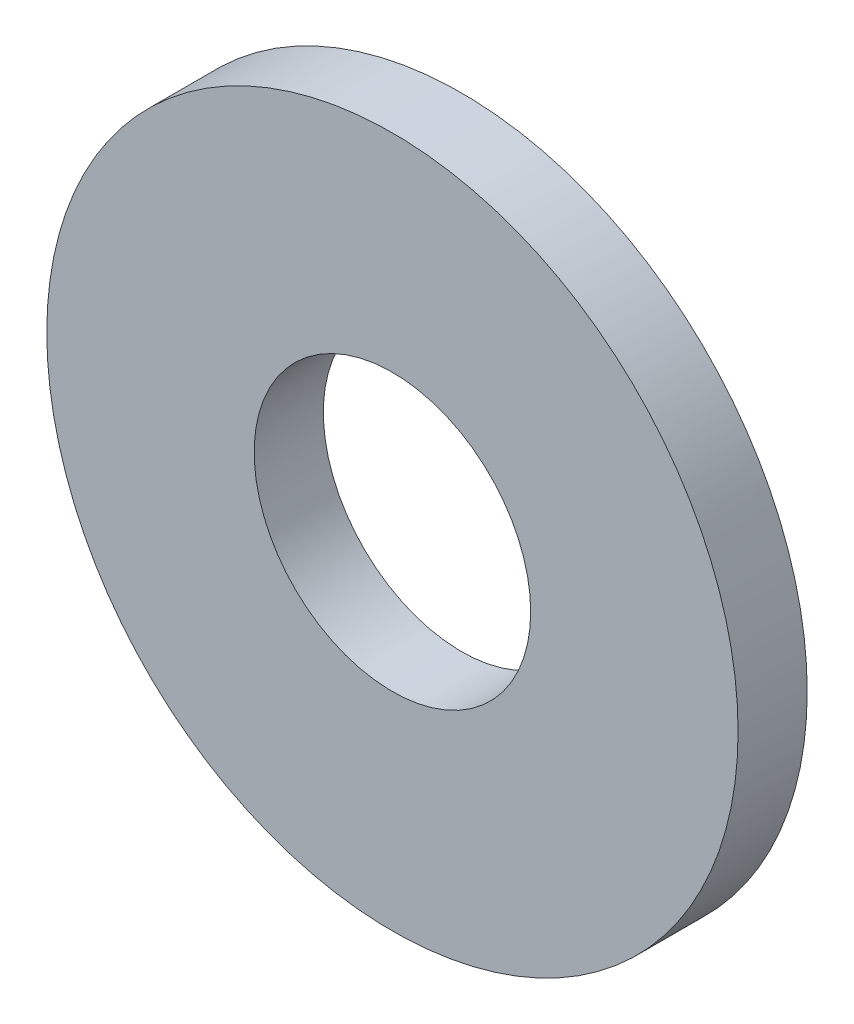
ISO-10303-21;
HEADER;
FILE_DESCRIPTION(('STEP AP214'),'2;1');
FILE_NAME('part.step','',(''),(''),'','','');
FILE_SCHEMA(('AUTOMOTIVE_DESIGN { 1 0 10303 214 1 1 1 1 }'));
ENDSEC;
DATA;
#1=APPLICATION_CONTEXT('core data for automotive mechanical design processes');
#2=APPLICATION_PROTOCOL_DEFINITION('international standard','automotive_design',2000,#1);
#3=PRODUCT_CONTEXT('',#1,'mechanical');
#4=PRODUCT('Part','Part','',(#3));
#5=PRODUCT_RELATED_PRODUCT_CATEGORY('part','',(#4));
#6=PRODUCT_DEFINITION_FORMATION('','',#4);
#7=PRODUCT_DEFINITION_CONTEXT('part definition',#1,'design');
#8=PRODUCT_DEFINITION('design','',#6,#7);
#9=PRODUCT_DEFINITION_SHAPE('','',#8);
#10=(LENGTH_UNIT() NAMED_UNIT(*) SI_UNIT(.MILLI.,.METRE.));
#11=(NAMED_UNIT(*) PLANE_ANGLE_UNIT() SI_UNIT($,.RADIAN.));
#12=(NAMED_UNIT(*) SI_UNIT($,.STERADIAN.) SOLID_ANGLE_UNIT());
#13=UNCERTAINTY_MEASURE_WITH_UNIT(LENGTH_MEASURE(1.E-05),#10,'distance_accuracy_value','');
#14=(GEOMETRIC_REPRESENTATION_CONTEXT(3) GLOBAL_UNCERTAINTY_ASSIGNED_CONTEXT((#13)) GLOBAL_UNIT_ASSIGNED_CONTEXT((#10,
#11,#12)) REPRESENTATION_CONTEXT('',''));
#15=CARTESIAN_POINT('',(0.,0.,0.));
#16=DIRECTION('',(0.,0.,1.));
#17=DIRECTION('',(1.,0.,0.));
#18=AXIS2_PLACEMENT_3D('',#15,#16,#17);
#19=CARTESIAN_POINT('',(0.,0.,0.79375));
#20=DIRECTION('',(0.,0.,1.));
#21=DIRECTION('',(1.,0.,0.));
#22=AXIS2_PLACEMENT_3D('',#19,#20,#21);
#23=PLANE('',#22);
#24=CARTESIAN_POINT('',(0.,0.,0.79375));
#25=DIRECTION('',(0.,0.,1.));
#26=DIRECTION('',(1.,0.,0.));
#27=AXIS2_PLACEMENT_3D('',#24,#25,#26);
#28=CIRCLE('',#27,7.9375);
#29=CARTESIAN_POINT('',(7.9375,0.,0.79375));
#30=VERTEX_POINT('',#29);
#31=EDGE_CURVE('E10',#30,#30,#28,.T.);
#32=ORIENTED_EDGE('',*,*,#31,.T.);
#33=EDGE_LOOP('',(#32));
#34=FACE_BOUND('',#33,.T.);
#35=CARTESIAN_POINT('',(0.,0.,0.79375));
#36=DIRECTION('',(0.,0.,1.));
#37=DIRECTION('',(1.,0.,0.));
#38=AXIS2_PLACEMENT_3D('',#35,#36,#37);
#39=CIRCLE('',#38,3.175);
#40=CARTESIAN_POINT('',(3.175,0.,0.79375));
#41=VERTEX_POINT('',#40);
#42=EDGE_CURVE('E43',#41,#41,#39,.T.);
#43=ORIENTED_EDGE('',*,*,#42,.F.);
#44=EDGE_LOOP('',(#43));
#45=FACE_BOUND('',#44,.T.);
#46=ADVANCED_FACE('F32',(#34,#45),#23,.T.);
#47=CARTESIAN_POINT('',(0.,0.,-0.79375));
#48=DIRECTION('',(0.,0.,1.));
#49=DIRECTION('',(1.,0.,0.));
#50=AXIS2_PLACEMENT_3D('',#47,#48,#49);
#51=PLANE('',#50);
#52=CARTESIAN_POINT('',(0.,0.,-0.79375));
#53=DIRECTION('',(0.,0.,1.));
#54=DIRECTION('',(1.,0.,0.));
#55=AXIS2_PLACEMENT_3D('',#52,#53,#54);
#56=CIRCLE('',#55,7.9375);
#57=CARTESIAN_POINT('',(7.9375,0.,-0.79375));
#58=VERTEX_POINT('',#57);
#59=EDGE_CURVE('E36',#58,#58,#56,.T.);
#60=ORIENTED_EDGE('',*,*,#59,.F.);
#61=EDGE_LOOP('',(#60));
#62=FACE_BOUND('',#61,.T.);
#63=CARTESIAN_POINT('',(0.,0.,-0.79375));
#64=DIRECTION('',(0.,0.,1.));
#65=DIRECTION('',(1.,0.,0.));
#66=AXIS2_PLACEMENT_3D('',#63,#64,#65);
#67=CIRCLE('',#66,3.175);
#68=CARTESIAN_POINT('',(3.175,0.,-0.79375));
#69=VERTEX_POINT('',#68);
#70=EDGE_CURVE('E45',#69,#69,#67,.T.);
#71=ORIENTED_EDGE('',*,*,#70,.T.);
#72=EDGE_LOOP('',(#71));
#73=FACE_BOUND('',#72,.T.);
#74=ADVANCED_FACE('F55',(#62,#73),#51,.F.);
#75=CARTESIAN_POINT('',(0.,0.,0.79375));
#76=DIRECTION('',(0.,0.,-1.));
#77=DIRECTION('',(-1.,0.,0.));
#78=AXIS2_PLACEMENT_3D('',#75,#76,#77);
#79=CYLINDRICAL_SURFACE('',#78,7.9375);
#80=ORIENTED_EDGE('',*,*,#31,.F.);
#81=EDGE_LOOP('',(#80));
#82=FACE_BOUND('',#81,.T.);
#83=ORIENTED_EDGE('',*,*,#59,.T.);
#84=EDGE_LOOP('',(#83));
#85=FACE_BOUND('',#84,.T.);
#86=ADVANCED_FACE('F34',(#82,#85),#79,.T.);
#87=CARTESIAN_POINT('',(0.,0.,0.79375));
#88=DIRECTION('',(0.,0.,-1.));
#89=DIRECTION('',(-1.,0.,0.));
#90=AXIS2_PLACEMENT_3D('',#87,#88,#89);
#91=CYLINDRICAL_SURFACE('',#90,3.175);
#92=ORIENTED_EDGE('',*,*,#42,.T.);
#93=EDGE_LOOP('',(#92));
#94=FACE_BOUND('',#93,.T.);
#95=ORIENTED_EDGE('',*,*,#70,.F.);
#96=EDGE_LOOP('',(#95));
#97=FACE_BOUND('',#96,.T.);
#98=ADVANCED_FACE('F51',(#94,#97),#91,.F.);
#99=CLOSED_SHELL('',(#46,#74,#86,#98));
#100=MANIFOLD_SOLID_BREP('B2',#99);
#101=ADVANCED_BREP_SHAPE_REPRESENTATION('',(#18,#100),#14);
#102=SHAPE_DEFINITION_REPRESENTATION(#9,#101);
ENDSEC;
END-ISO-10303-21;
